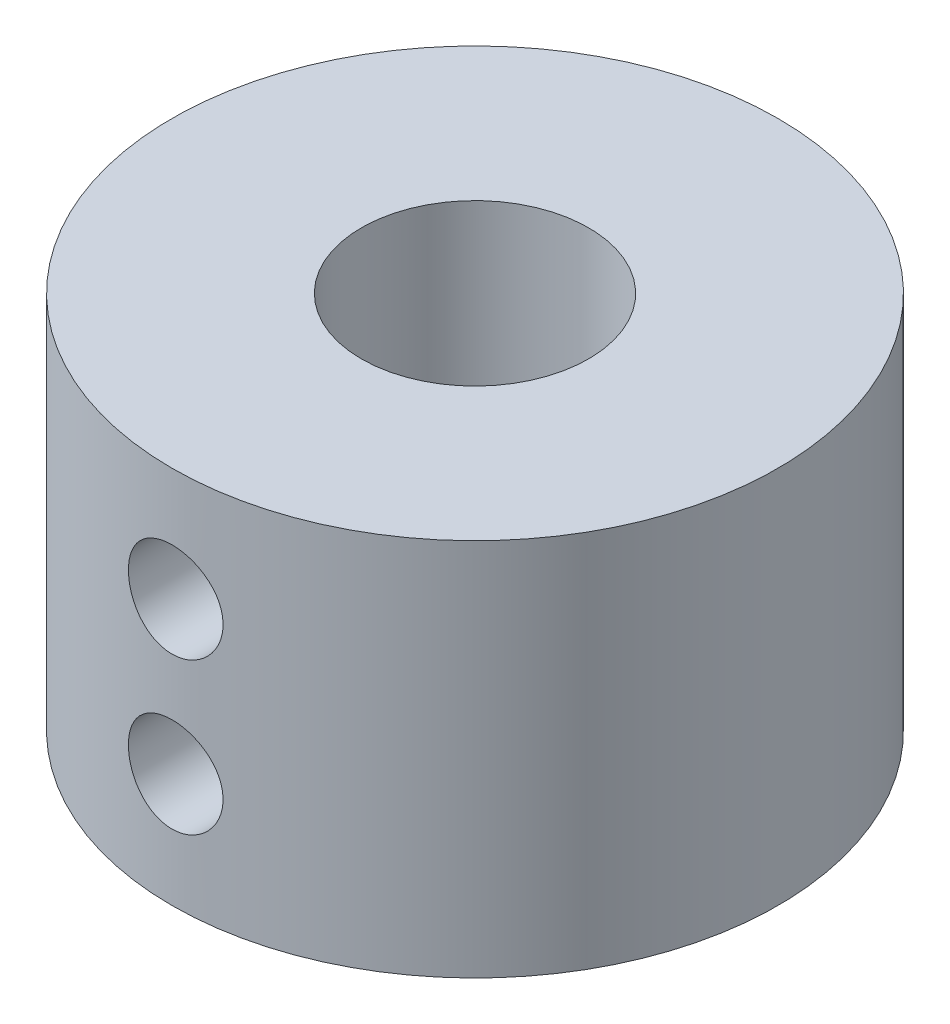
ISO-10303-21;
HEADER;
FILE_DESCRIPTION(('STEP AP214'),'2;1');
FILE_NAME('part.step','',(''),(''),'','','');
FILE_SCHEMA(('AUTOMOTIVE_DESIGN { 1 0 10303 214 1 1 1 1 }'));
ENDSEC;
DATA;
#1=APPLICATION_CONTEXT('core data for automotive mechanical design processes');
#2=APPLICATION_PROTOCOL_DEFINITION('international standard','automotive_design',2000,#1);
#3=PRODUCT_CONTEXT('',#1,'mechanical');
#4=PRODUCT('Part','Part','',(#3));
#5=PRODUCT_RELATED_PRODUCT_CATEGORY('part','',(#4));
#6=PRODUCT_DEFINITION_FORMATION('','',#4);
#7=PRODUCT_DEFINITION_CONTEXT('part definition',#1,'design');
#8=PRODUCT_DEFINITION('design','',#6,#7);
#9=PRODUCT_DEFINITION_SHAPE('','',#8);
#10=(LENGTH_UNIT() NAMED_UNIT(*) SI_UNIT(.MILLI.,.METRE.));
#11=(NAMED_UNIT(*) PLANE_ANGLE_UNIT() SI_UNIT($,.RADIAN.));
#12=(NAMED_UNIT(*) SI_UNIT($,.STERADIAN.) SOLID_ANGLE_UNIT());
#13=UNCERTAINTY_MEASURE_WITH_UNIT(LENGTH_MEASURE(1.E-05),#10,'distance_accuracy_value','');
#14=(GEOMETRIC_REPRESENTATION_CONTEXT(3) GLOBAL_UNCERTAINTY_ASSIGNED_CONTEXT((#13)) GLOBAL_UNIT_ASSIGNED_CONTEXT((#10,
#11,#12)) REPRESENTATION_CONTEXT('',''));
#15=CARTESIAN_POINT('',(0.,0.,0.));
#16=DIRECTION('',(0.,0.,1.));
#17=DIRECTION('',(1.,0.,0.));
#18=AXIS2_PLACEMENT_3D('',#15,#16,#17);
#19=CARTESIAN_POINT('',(0.,15.875,0.));
#20=DIRECTION('',(0.,-1.,0.));
#21=DIRECTION('',(0.,0.,-1.));
#22=AXIS2_PLACEMENT_3D('',#19,#20,#21);
#23=CYLINDRICAL_SURFACE('',#22,12.7);
#24=CARTESIAN_POINT('',(0.,15.875,0.));
#25=DIRECTION('',(0.,1.,0.));
#26=DIRECTION('',(0.,0.,1.));
#27=AXIS2_PLACEMENT_3D('',#24,#25,#26);
#28=CIRCLE('',#27,12.7);
#29=CARTESIAN_POINT('',(0.,15.875,12.7));
#30=VERTEX_POINT('',#29);
#31=EDGE_CURVE('E10',#30,#30,#28,.T.);
#32=ORIENTED_EDGE('',*,*,#31,.F.);
#33=EDGE_LOOP('',(#32));
#34=FACE_BOUND('',#33,.T.);
#35=CARTESIAN_POINT('',(0.,0.,0.));
#36=DIRECTION('',(0.,1.,0.));
#37=DIRECTION('',(0.,0.,1.));
#38=AXIS2_PLACEMENT_3D('',#35,#36,#37);
#39=CIRCLE('',#38,12.7);
#40=CARTESIAN_POINT('',(0.,0.,12.7));
#41=VERTEX_POINT('',#40);
#42=EDGE_CURVE('E43',#41,#41,#39,.T.);
#43=ORIENTED_EDGE('',*,*,#42,.T.);
#44=EDGE_LOOP('',(#43));
#45=FACE_BOUND('',#44,.T.);
#46=CARTESIAN_POINT('',(0.,2.778125,12.7));
#47=CARTESIAN_POINT('',(0.110740108458882,2.77812952300302,12.6999981759187));
#48=CARTESIAN_POINT('',(0.221543090112152,2.78742625280776,12.6985364241056));
#49=CARTESIAN_POINT('',(0.440048106263868,2.82435592995092,12.6928459161496));
#50=CARTESIAN_POINT('',(0.547747079925383,2.85200637092466,12.688614520205));
#51=CARTESIAN_POINT('',(0.756850577075127,2.92479385735275,12.6778599087533));
#52=CARTESIAN_POINT('',(0.858259929630111,2.96991728958077,12.6713384777827));
#53=CARTESIAN_POINT('',(1.05205311801665,3.07633572020615,12.6567231151778));
#54=CARTESIAN_POINT('',(1.14443812447984,3.13762861728478,12.648629387909));
#55=CARTESIAN_POINT('',(1.31835517987347,3.27519748213095,12.6316920055389));
#56=CARTESIAN_POINT('',(1.39979993656947,3.35158317719414,12.6228431454267));
#57=CARTESIAN_POINT('',(1.54877110253116,3.51693317143843,12.6054332292841));
#58=CARTESIAN_POINT('',(1.61629668369265,3.60589821848203,12.5968721904028));
#59=CARTESIAN_POINT('',(1.73585619561051,3.79447287787908,12.5809567732616));
#60=CARTESIAN_POINT('',(1.78780498386656,3.89413708912467,12.5736091220522));
#61=CARTESIAN_POINT('',(1.8741920351767,4.10091049486838,12.56102391383));
#62=CARTESIAN_POINT('',(1.90863133489238,4.20801924818026,12.5557862318988));
#63=CARTESIAN_POINT('',(1.9587492521197,4.42572052778288,12.5480654114313));
#64=CARTESIAN_POINT('',(1.974577787307,4.53627774624367,12.5455602731006));
#65=CARTESIAN_POINT('',(1.98748943495112,4.75850520618354,12.5435214828822));
#66=CARTESIAN_POINT('',(1.98457371420495,4.87017537795117,12.5439876460362));
#67=CARTESIAN_POINT('',(1.96020198517056,5.09039576903307,12.5478186817382));
#68=CARTESIAN_POINT('',(1.93891346849256,5.19896504603656,12.551157366718));
#69=CARTESIAN_POINT('',(1.8786628815554,5.41097153004771,12.5603163222422));
#70=CARTESIAN_POINT('',(1.8397002725553,5.51440858050843,12.5661366684321));
#71=CARTESIAN_POINT('',(1.74503490328574,5.71372104068749,12.5796318356586));
#72=CARTESIAN_POINT('',(1.68926170525467,5.80956244721987,12.58731443263));
#73=CARTESIAN_POINT('',(1.56260846153893,5.99058963145039,12.6036629288164));
#74=CARTESIAN_POINT('',(1.49172734144582,6.07577465062943,12.6123288979439));
#75=CARTESIAN_POINT('',(1.33595339252727,6.23404125826519,12.6297831783506));
#76=CARTESIAN_POINT('',(1.25091666694928,6.30698125687638,12.6385717957325));
#77=CARTESIAN_POINT('',(1.06973445198237,6.43757693435167,12.6551938074484));
#78=CARTESIAN_POINT('',(0.973588906165797,6.49523253557323,12.6630271969298));
#79=CARTESIAN_POINT('',(0.77279176710109,6.59363209577903,12.6768653547771));
#80=CARTESIAN_POINT('',(0.668134447828366,6.63436455583557,12.6828688790516));
#81=CARTESIAN_POINT('',(0.453349943165552,6.69763548666124,12.6923606325054));
#82=CARTESIAN_POINT('',(0.343223159982964,6.72017529316527,12.6958490463463));
#83=CARTESIAN_POINT('',(0.121847242306214,6.74623148818234,12.6998929368353));
#84=CARTESIAN_POINT('',(0.0106215350725314,6.74994243018735,12.7004784073558));
#85=CARTESIAN_POINT('',(-0.210863296214241,6.73875279013957,12.6987322740244));
#86=CARTESIAN_POINT('',(-0.321122452690593,6.7238528348199,12.6964007684034));
#87=CARTESIAN_POINT('',(-0.536950797973403,6.67602615477886,12.6891012068149));
#88=CARTESIAN_POINT('',(-0.642541626756983,6.64319477312499,12.6841470997096));
#89=CARTESIAN_POINT('',(-0.846720166361197,6.56053814382096,12.6721558507382));
#90=CARTESIAN_POINT('',(-0.94530752410003,6.51071204011113,12.6651186039424));
#91=CARTESIAN_POINT('',(-1.13353231053626,6.39502785704328,12.6496680961312));
#92=CARTESIAN_POINT('',(-1.22309344200333,6.32904704780318,12.6412444712659));
#93=CARTESIAN_POINT('',(-1.38994115353071,6.18309653181069,12.6239895511865));
#94=CARTESIAN_POINT('',(-1.4672269554232,6.10312593888115,12.6151582301731));
#95=CARTESIAN_POINT('',(-1.60804289116498,5.93059742470884,12.5979874685722));
#96=CARTESIAN_POINT('',(-1.6714422262615,5.83793215259665,12.589653201952));
#97=CARTESIAN_POINT('',(-1.78177481883021,5.64315286653132,12.5745136241463));
#98=CARTESIAN_POINT('',(-1.82870855030121,5.54103912468023,12.5677082689496));
#99=CARTESIAN_POINT('',(-1.90457750231339,5.33064272268311,12.5564350038593));
#100=CARTESIAN_POINT('',(-1.93358019864905,5.22238488416729,12.5519583411449));
#101=CARTESIAN_POINT('',(-1.97297771869675,5.00245924221671,12.5458265266038));
#102=CARTESIAN_POINT('',(-1.98337394698717,4.89079169682366,12.5441711618015));
#103=CARTESIAN_POINT('',(-1.98522790573288,4.66852101924844,12.5438777732313));
#104=CARTESIAN_POINT('',(-1.97689137060312,4.55791959180903,12.5452069710905));
#105=CARTESIAN_POINT('',(-1.94195877209371,4.33971279539172,12.5506614853508));
#106=CARTESIAN_POINT('',(-1.91536274825276,4.23210741992676,12.5547867956971));
#107=CARTESIAN_POINT('',(-1.84474111851657,4.02301247510409,12.5653568927858));
#108=CARTESIAN_POINT('',(-1.80073110879998,3.92151752663239,12.5717996035677));
#109=CARTESIAN_POINT('',(-1.69655147533719,3.72731854414446,12.5862808983762));
#110=CARTESIAN_POINT('',(-1.63638121114078,3.63461485873356,12.5943195456484));
#111=CARTESIAN_POINT('',(-1.50084637710394,3.45958672434933,12.6111918217323));
#112=CARTESIAN_POINT('',(-1.42532978756472,3.37738069393777,12.6200328717098));
#113=CARTESIAN_POINT('',(-1.26156715744074,3.22673564361803,12.6374528463983));
#114=CARTESIAN_POINT('',(-1.17331817087256,3.1582998186177,12.6460317098872));
#115=CARTESIAN_POINT('',(-0.985969944206959,3.0367674667187,12.6620198757501));
#116=CARTESIAN_POINT('',(-0.886808751638015,2.98376548537206,12.6694218482903));
#117=CARTESIAN_POINT('',(-0.680919931621491,2.89524995927185,12.6821506249711));
#118=CARTESIAN_POINT('',(-0.574200160161773,2.85971855303178,12.6874795473781));
#119=CARTESIAN_POINT('',(-0.389186927929827,2.81508753950935,12.6942647265525));
#120=CARTESIAN_POINT('',(-0.312027550673476,2.80124813556323,12.6964042460323));
#121=CARTESIAN_POINT('',(-0.156589252043899,2.78276533125536,12.6992725177874));
#122=CARTESIAN_POINT('',(-0.0783103464342374,2.77812180153886,12.700001289907));
#123=CARTESIAN_POINT('',(0.,2.778125,12.7));
#124=B_SPLINE_CURVE_WITH_KNOTS('',3,(#46,#47,#48,#49,#50,#51,#52,#53,#54,#55,#56,#57,#58,#59,
#60,#61,#62,#63,#64,#65,#66,#67,#68,#69,#70,#71,#72,#73,#74,#75,#76,#77,#78,#79,#80,#81,#82,#83,
#84,#85,#86,#87,#88,#89,#90,#91,#92,#93,#94,#95,#96,#97,#98,#99,#100,#101,#102,#103,#104,#105,
#106,#107,#108,#109,#110,#111,#112,#113,#114,#115,#116,#117,#118,#119,#120,#121,#122,#123),
.UNSPECIFIED.,.T.,.F.,(4,2,2,2,2,2,2,2,2,2,2,2,2,2,2,2,2,2,2,2,2,2,2,2,2,2,2,2,2,2,2,2,2,2,2,2,
2,2,4),(0.,0.331934137754008,0.664185110006611,0.996177744306316,1.32812725541174,
1.66258532220808,1.99706328143553,2.33333749268321,2.66959179226083,3.00311844713402,
3.33662434075995,3.66712163467923,3.99762900348021,4.32954094563113,4.66147649976829,
4.99701925040403,5.332563705516,5.66833578480185,6.00408320889956,6.33635427867194,
6.66861415931883,6.99912434275525,7.32965117713987,7.66277154791551,7.99591302771124,
8.33206899948113,8.66821529346378,9.00308882001135,9.33793706632004,9.66912580393961,
10.0003138244125,10.3312058977975,10.6621110867663,10.9964697227546,11.330905846067,
11.6673495395862,12.0034485423967,12.2381805047903,12.4729091652785),.UNSPECIFIED.);
#125=CARTESIAN_POINT('',(0.,2.778125,12.7));
#126=VERTEX_POINT('',#125);
#127=EDGE_CURVE('E59',#126,#126,#124,.T.);
#128=ORIENTED_EDGE('',*,*,#127,.F.);
#129=EDGE_LOOP('',(#128));
#130=FACE_BOUND('',#129,.T.);
#131=CARTESIAN_POINT('',(0.,9.128125,12.7));
#132=CARTESIAN_POINT('',(0.110740108458882,9.12812952300302,12.6999981759187));
#133=CARTESIAN_POINT('',(0.221543090112152,9.13742625280776,12.6985364241056));
#134=CARTESIAN_POINT('',(0.440048106263868,9.17435592995093,12.6928459161496));
#135=CARTESIAN_POINT('',(0.547747079925383,9.20200637092466,12.688614520205));
#136=CARTESIAN_POINT('',(0.756850577075127,9.27479385735275,12.6778599087533));
#137=CARTESIAN_POINT('',(0.85825992963011,9.31991728958077,12.6713384777827));
#138=CARTESIAN_POINT('',(1.05205311801665,9.42633572020615,12.6567231151778));
#139=CARTESIAN_POINT('',(1.14443812447984,9.48762861728478,12.648629387909));
#140=CARTESIAN_POINT('',(1.31835517987347,9.62519748213096,12.6316920055389));
#141=CARTESIAN_POINT('',(1.39979993656947,9.70158317719414,12.6228431454267));
#142=CARTESIAN_POINT('',(1.54877110253116,9.86693317143843,12.6054332292841));
#143=CARTESIAN_POINT('',(1.61629668369265,9.95589821848203,12.5968721904028));
#144=CARTESIAN_POINT('',(1.73585619561051,10.1444728778791,12.5809567732616));
#145=CARTESIAN_POINT('',(1.78780498386656,10.2441370891247,12.5736091220522));
#146=CARTESIAN_POINT('',(1.8741920351767,10.4509104948684,12.56102391383));
#147=CARTESIAN_POINT('',(1.90863133489238,10.5580192481803,12.5557862318988));
#148=CARTESIAN_POINT('',(1.9587492521197,10.7757205277829,12.5480654114313));
#149=CARTESIAN_POINT('',(1.974577787307,10.8862777462437,12.5455602731006));
#150=CARTESIAN_POINT('',(1.98748943495112,11.1085052061835,12.5435214828822));
#151=CARTESIAN_POINT('',(1.98457371420495,11.2201753779512,12.5439876460362));
#152=CARTESIAN_POINT('',(1.96020198517056,11.4403957690331,12.5478186817382));
#153=CARTESIAN_POINT('',(1.93891346849256,11.5489650460366,12.551157366718));
#154=CARTESIAN_POINT('',(1.8786628815554,11.7609715300477,12.5603163222422));
#155=CARTESIAN_POINT('',(1.8397002725553,11.8644085805084,12.5661366684321));
#156=CARTESIAN_POINT('',(1.74503490328574,12.0637210406875,12.5796318356586));
#157=CARTESIAN_POINT('',(1.68926170525467,12.1595624472199,12.58731443263));
#158=CARTESIAN_POINT('',(1.56260846153893,12.3405896314504,12.6036629288164));
#159=CARTESIAN_POINT('',(1.49172734144582,12.4257746506294,12.6123288979439));
#160=CARTESIAN_POINT('',(1.33595339252727,12.5840412582652,12.6297831783506));
#161=CARTESIAN_POINT('',(1.25091666694928,12.6569812568764,12.6385717957325));
#162=CARTESIAN_POINT('',(1.06973445198237,12.7875769343517,12.6551938074484));
#163=CARTESIAN_POINT('',(0.973588906165797,12.8452325355732,12.6630271969298));
#164=CARTESIAN_POINT('',(0.772791767101091,12.943632095779,12.6768653547771));
#165=CARTESIAN_POINT('',(0.668134447828366,12.9843645558356,12.6828688790516));
#166=CARTESIAN_POINT('',(0.453349943165554,13.0476354866612,12.6923606325054));
#167=CARTESIAN_POINT('',(0.343223159982966,13.0701752931653,12.6958490463463));
#168=CARTESIAN_POINT('',(0.121847242306215,13.0962314881823,12.6998929368353));
#169=CARTESIAN_POINT('',(0.0106215350725325,13.0999424301873,12.7004784073558));
#170=CARTESIAN_POINT('',(-0.21086329621424,13.0887527901396,12.6987322740244));
#171=CARTESIAN_POINT('',(-0.321122452690592,13.0738528348199,12.6964007684034));
#172=CARTESIAN_POINT('',(-0.536950797973402,13.0260261547789,12.6891012068149));
#173=CARTESIAN_POINT('',(-0.642541626756983,12.993194773125,12.6841470997096));
#174=CARTESIAN_POINT('',(-0.846720166361197,12.910538143821,12.6721558507382));
#175=CARTESIAN_POINT('',(-0.945307524100029,12.8607120401111,12.6651186039424));
#176=CARTESIAN_POINT('',(-1.13353231053626,12.7450278570433,12.6496680961312));
#177=CARTESIAN_POINT('',(-1.22309344200333,12.6790470478032,12.6412444712659));
#178=CARTESIAN_POINT('',(-1.38994115353071,12.5330965318107,12.6239895511865));
#179=CARTESIAN_POINT('',(-1.4672269554232,12.4531259388812,12.6151582301731));
#180=CARTESIAN_POINT('',(-1.60804289116498,12.2805974247088,12.5979874685722));
#181=CARTESIAN_POINT('',(-1.6714422262615,12.1879321525967,12.589653201952));
#182=CARTESIAN_POINT('',(-1.78177481883021,11.9931528665313,12.5745136241463));
#183=CARTESIAN_POINT('',(-1.82870855030121,11.8910391246802,12.5677082689496));
#184=CARTESIAN_POINT('',(-1.90457750231339,11.6806427226831,12.5564350038593));
#185=CARTESIAN_POINT('',(-1.93358019864905,11.5723848841673,12.5519583411449));
#186=CARTESIAN_POINT('',(-1.97297771869675,11.3524592422167,12.5458265266038));
#187=CARTESIAN_POINT('',(-1.98337394698717,11.2407916968237,12.5441711618015));
#188=CARTESIAN_POINT('',(-1.98522790573288,11.0185210192484,12.5438777732313));
#189=CARTESIAN_POINT('',(-1.97689137060312,10.907919591809,12.5452069710905));
#190=CARTESIAN_POINT('',(-1.94195877209371,10.6897127953917,12.5506614853508));
#191=CARTESIAN_POINT('',(-1.91536274825276,10.5821074199268,12.5547867956971));
#192=CARTESIAN_POINT('',(-1.84474111851657,10.3730124751041,12.5653568927858));
#193=CARTESIAN_POINT('',(-1.80073110879999,10.2715175266324,12.5717996035677));
#194=CARTESIAN_POINT('',(-1.69655147533719,10.0773185441445,12.5862808983762));
#195=CARTESIAN_POINT('',(-1.63638121114078,9.98461485873356,12.5943195456484));
#196=CARTESIAN_POINT('',(-1.50084637710394,9.80958672434933,12.6111918217323));
#197=CARTESIAN_POINT('',(-1.42532978756472,9.72738069393777,12.6200328717098));
#198=CARTESIAN_POINT('',(-1.26156715744075,9.57673564361803,12.6374528463983));
#199=CARTESIAN_POINT('',(-1.17331817087256,9.5082998186177,12.6460317098872));
#200=CARTESIAN_POINT('',(-0.98596994420696,9.3867674667187,12.6620198757501));
#201=CARTESIAN_POINT('',(-0.886808751638016,9.33376548537206,12.6694218482903));
#202=CARTESIAN_POINT('',(-0.680919931621491,9.24524995927185,12.6821506249711));
#203=CARTESIAN_POINT('',(-0.574200160161774,9.20971855303178,12.6874795473781));
#204=CARTESIAN_POINT('',(-0.389186927929828,9.16508753950935,12.6942647265525));
#205=CARTESIAN_POINT('',(-0.312027550673478,9.15124813556323,12.6964042460323));
#206=CARTESIAN_POINT('',(-0.1565892520439,9.13276533125536,12.6992725177874));
#207=CARTESIAN_POINT('',(-0.0783103464342379,9.12812180153886,12.700001289907));
#208=CARTESIAN_POINT('',(0.,9.128125,12.7));
#209=B_SPLINE_CURVE_WITH_KNOTS('',3,(#131,#132,#133,#134,#135,#136,#137,#138,#139,#140,#141,
#142,#143,#144,#145,#146,#147,#148,#149,#150,#151,#152,#153,#154,#155,#156,#157,#158,#159,#160,
#161,#162,#163,#164,#165,#166,#167,#168,#169,#170,#171,#172,#173,#174,#175,#176,#177,#178,#179,
#180,#181,#182,#183,#184,#185,#186,#187,#188,#189,#190,#191,#192,#193,#194,#195,#196,#197,#198,
#199,#200,#201,#202,#203,#204,#205,#206,#207,#208),.UNSPECIFIED.,.T.,.F.,(4,2,2,2,2,2,2,2,2,2,2,
2,2,2,2,2,2,2,2,2,2,2,2,2,2,2,2,2,2,2,2,2,2,2,2,2,2,2,4),(0.,0.331934137754008,
0.664185110006611,0.996177744306315,1.32812725541174,1.66258532220808,1.99706328143553,
2.33333749268321,2.66959179226083,3.00311844713402,3.33662434075995,3.66712163467923,
3.99762900348021,4.32954094563113,4.66147649976829,4.99701925040403,5.332563705516,
5.66833578480185,6.00408320889956,6.33635427867194,6.66861415931883,6.99912434275525,
7.32965117713987,7.66277154791551,7.99591302771124,8.33206899948113,8.66821529346379,
9.00308882001135,9.33793706632004,9.66912580393961,10.0003138244125,10.3312058977975,
10.6621110867663,10.9964697227546,11.330905846067,11.6673495395863,12.0034485423967,
12.2381805047903,12.4729091652785),.UNSPECIFIED.);
#210=CARTESIAN_POINT('',(0.,9.128125,12.7));
#211=VERTEX_POINT('',#210);
#212=EDGE_CURVE('E60',#211,#211,#209,.T.);
#213=ORIENTED_EDGE('',*,*,#212,.F.);
#214=EDGE_LOOP('',(#213));
#215=FACE_BOUND('',#214,.T.);
#216=ADVANCED_FACE('F30',(#34,#45,#130,#215),#23,.T.);
#217=CARTESIAN_POINT('',(0.,0.,0.));
#218=DIRECTION('',(0.,1.,0.));
#219=DIRECTION('',(0.,0.,1.));
#220=AXIS2_PLACEMENT_3D('',#217,#218,#219);
#221=CYLINDRICAL_SURFACE('',#220,4.7625);
#222=CARTESIAN_POINT('',(0.,2.778125,4.7625));
#223=CARTESIAN_POINT('',(-0.106295908560074,2.77813643808244,4.76249140158045));
#224=CARTESIAN_POINT('',(-0.212758967838847,2.78671648416341,4.75890007347352));
#225=CARTESIAN_POINT('',(-0.422667701710701,2.82073201556078,4.74488118807538));
#226=CARTESIAN_POINT('',(-0.526104765072409,2.84621148508699,4.73443579242881));
#227=CARTESIAN_POINT('',(-0.726580864674277,2.91292135820168,4.70783108848027));
#228=CARTESIAN_POINT('',(-0.823640282526702,2.95409840578068,4.69169114960318));
#229=CARTESIAN_POINT('',(-1.00937973872919,3.0508143568817,4.65526892272179));
#230=CARTESIAN_POINT('',(-1.0980623041503,3.10634891011625,4.63498788984898));
#231=CARTESIAN_POINT('',(-1.26912434065073,3.23314850986302,4.59117427508592));
#232=CARTESIAN_POINT('',(-1.35102801218446,3.30501832770373,4.56753520905172));
#233=CARTESIAN_POINT('',(-1.50202871598238,3.46116963146733,4.52013183583765));
#234=CARTESIAN_POINT('',(-1.57111900525552,3.54545761077003,4.4963674694456));
#235=CARTESIAN_POINT('',(-1.69789058594092,3.72908000938427,4.4500962212813));
#236=CARTESIAN_POINT('',(-1.75484326694356,3.82895069937714,4.42770874161498));
#237=CARTESIAN_POINT('',(-1.85092880684824,4.03792254694948,4.38841471116745));
#238=CARTESIAN_POINT('',(-1.89007084577612,4.14701891493157,4.37150533813807));
#239=CARTESIAN_POINT('',(-1.94745924820552,4.36586898568157,4.34623456677981));
#240=CARTESIAN_POINT('',(-1.96662131880699,4.47533789238504,4.33750065397212));
#241=CARTESIAN_POINT('',(-1.98636270823877,4.69625885213993,4.32849855373462));
#242=CARTESIAN_POINT('',(-1.98695227536356,4.80770977754086,4.328225697501));
#243=CARTESIAN_POINT('',(-1.97022164952332,5.02031009594046,4.33586127302853));
#244=CARTESIAN_POINT('',(-1.95427093765778,5.12159424079608,4.34314413823751));
#245=CARTESIAN_POINT('',(-1.90720965737546,5.31989044446312,4.36401341403402));
#246=CARTESIAN_POINT('',(-1.87609618568393,5.41690168124319,4.37760103179407));
#247=CARTESIAN_POINT('',(-1.79898609480019,5.60634785349891,4.40985568326751));
#248=CARTESIAN_POINT('',(-1.75268686068537,5.69864148069999,4.42862465094254));
#249=CARTESIAN_POINT('',(-1.64673347596643,5.87450840253473,4.46910350686474));
#250=CARTESIAN_POINT('',(-1.58707405869978,5.95807823909896,4.49081455356025));
#251=CARTESIAN_POINT('',(-1.45017484530084,6.12155868448838,4.53696350793792));
#252=CARTESIAN_POINT('',(-1.37187540459195,6.20056317572438,4.561476802296));
#253=CARTESIAN_POINT('',(-1.20289572579428,6.3446239359477,4.6089200606614));
#254=CARTESIAN_POINT('',(-1.11221259562443,6.40967693756133,4.63184965292253));
#255=CARTESIAN_POINT('',(-0.918286118550738,6.52531686999082,4.67420775145901));
#256=CARTESIAN_POINT('',(-0.814801174635695,6.57553524417671,4.69354323137542));
#257=CARTESIAN_POINT('',(-0.599840689011348,6.65753230912018,4.72582051746));
#258=CARTESIAN_POINT('',(-0.488369601737121,6.68932119071081,4.73876585655208));
#259=CARTESIAN_POINT('',(-0.26817337993714,6.73166038750104,4.75614430383386));
#260=CARTESIAN_POINT('',(-0.159720415379842,6.74342672369195,4.76106396412311));
#261=CARTESIAN_POINT('',(0.0577130156000391,6.74901212998737,4.76338979960382));
#262=CARTESIAN_POINT('',(0.166693321604807,6.74283635277505,4.76079813192703));
#263=CARTESIAN_POINT('',(0.376393459717026,6.71358340287037,4.74870808030392));
#264=CARTESIAN_POINT('',(0.477254834540024,6.6913601978707,4.73955883563333));
#265=CARTESIAN_POINT('',(0.673707613991605,6.63183174116651,4.71564663251208));
#266=CARTESIAN_POINT('',(0.769298351097896,6.5945245840539,4.7008829648603));
#267=CARTESIAN_POINT('',(0.955848037292253,6.50466857605702,4.666587546492));
#268=CARTESIAN_POINT('',(1.04657086350783,6.45168225925568,4.64692192707484));
#269=CARTESIAN_POINT('',(1.21816211826739,6.33245276275569,4.60492164769306));
#270=CARTESIAN_POINT('',(1.29902640975558,6.26620404819728,4.58258587495364));
#271=CARTESIAN_POINT('',(1.45467932056039,6.11679111718006,4.53567939534007));
#272=CARTESIAN_POINT('',(1.52862073304299,6.03275637650931,4.51106304400759));
#273=CARTESIAN_POINT('',(1.66158838069249,5.85307872445257,4.46380134619208));
#274=CARTESIAN_POINT('',(1.72061122865918,5.75743318416488,4.44115644808334));
#275=CARTESIAN_POINT('',(1.8227033683131,5.55527499670716,4.40025450662331));
#276=CARTESIAN_POINT('',(1.8655334520176,5.44862696862021,4.38206455556239));
#277=CARTESIAN_POINT('',(1.93226394648122,5.22863668232646,4.35305764608594));
#278=CARTESIAN_POINT('',(1.95617996596104,5.11530002705769,4.34223460919756));
#279=CARTESIAN_POINT('',(1.9828522755388,4.89455031502126,4.33011523702906));
#280=CARTESIAN_POINT('',(1.98709566405843,4.78735284861048,4.32814969660371));
#281=CARTESIAN_POINT('',(1.97827226144211,4.57383695793851,4.33218991655));
#282=CARTESIAN_POINT('',(1.96520812768995,4.46751840125201,4.33819445320236));
#283=CARTESIAN_POINT('',(1.9233896758903,4.26387776339314,4.3568866269235));
#284=CARTESIAN_POINT('',(1.89539409419703,4.16636728087687,4.36925013318787));
#285=CARTESIAN_POINT('',(1.82524921020889,3.9774050160954,4.39901300153712));
#286=CARTESIAN_POINT('',(1.78309593083638,3.88595494492943,4.41641377846563));
#287=CARTESIAN_POINT('',(1.6829132892259,3.70570776518077,4.45558790364021));
#288=CARTESIAN_POINT('',(1.62408172945392,3.61740080085784,4.47756125557966));
#289=CARTESIAN_POINT('',(1.49333596530075,3.45144702876492,4.5228460637297));
#290=CARTESIAN_POINT('',(1.42141722463767,3.37380393373409,4.54615798199076));
#291=CARTESIAN_POINT('',(1.26031949767388,3.22556396782547,4.59353273649544));
#292=CARTESIAN_POINT('',(1.17026489966908,3.15589216286547,4.61752660299969));
#293=CARTESIAN_POINT('',(0.978852625814456,3.0326021174995,4.66185477999957));
#294=CARTESIAN_POINT('',(0.877489827988874,2.97899119261283,4.68218742117825));
#295=CARTESIAN_POINT('',(0.667912140039749,2.89050437036418,4.71660828587906));
#296=CARTESIAN_POINT('',(0.559838210681762,2.85533343299504,4.73079417348867));
#297=CARTESIAN_POINT('',(0.338789044681414,2.80399120258894,4.75172103007692));
#298=CARTESIAN_POINT('',(0.225830315707272,2.78776042248381,4.75848530476497));
#299=CARTESIAN_POINT('',(0.0749872800467045,2.77918360677526,4.76206006515682));
#300=CARTESIAN_POINT('',(0.0375040440476062,2.77812096433811,4.76250303375275));
#301=CARTESIAN_POINT('',(0.,2.778125,4.7625));
#302=B_SPLINE_CURVE_WITH_KNOTS('',3,(#222,#223,#224,#225,#226,#227,#228,#229,#230,#231,#232,
#233,#234,#235,#236,#237,#238,#239,#240,#241,#242,#243,#244,#245,#246,#247,#248,#249,#250,#251,
#252,#253,#254,#255,#256,#257,#258,#259,#260,#261,#262,#263,#264,#265,#266,#267,#268,#269,#270,
#271,#272,#273,#274,#275,#276,#277,#278,#279,#280,#281,#282,#283,#284,#285,#286,#287,#288,#289,
#290,#291,#292,#293,#294,#295,#296,#297,#298,#299,#300,#301),.UNSPECIFIED.,.T.,.F.,(4,2,2,2,2,2,
2,2,2,2,2,2,2,2,2,2,2,2,2,2,2,2,2,2,2,2,2,2,2,2,2,2,2,2,2,2,2,2,2,4),(0.,0.318780983728253,
0.638394933248056,0.956932064901253,1.2753727935041,1.60842223858481,1.94164645533701,
2.29126612705861,2.64070539184808,2.97331246105873,3.30573599470361,3.61267624559058,
3.9196752906695,4.23320706980709,4.54686266326065,4.88702574040536,5.22726839536908,
5.57536437409041,5.92326768446547,6.24916903886786,6.5749768089541,6.88461586205458,
7.19429404105334,7.51359202244556,7.83302353682825,8.17528349746505,8.51762109719042,
8.86483476520744,9.21176159730897,9.53198305625935,9.8521553543484,10.1574226931906,
10.462775857341,10.7864893076844,11.1103151781369,11.4577262432026,11.8052953096788,
12.1471190861328,12.4878663512005,12.6003408219232),.UNSPECIFIED.);
#303=CARTESIAN_POINT('',(0.,2.778125,4.7625));
#304=VERTEX_POINT('',#303);
#305=EDGE_CURVE('E53',#304,#304,#302,.T.);
#306=ORIENTED_EDGE('',*,*,#305,.F.);
#307=EDGE_LOOP('',(#306));
#308=FACE_BOUND('',#307,.T.);
#309=CARTESIAN_POINT('',(0.,0.,0.));
#310=DIRECTION('',(0.,1.,0.));
#311=DIRECTION('',(0.,0.,1.));
#312=AXIS2_PLACEMENT_3D('',#309,#310,#311);
#313=CIRCLE('',#312,4.7625);
#314=CARTESIAN_POINT('',(0.,0.,4.7625));
#315=VERTEX_POINT('',#314);
#316=EDGE_CURVE('E48',#315,#315,#313,.T.);
#317=ORIENTED_EDGE('',*,*,#316,.F.);
#318=EDGE_LOOP('',(#317));
#319=FACE_BOUND('',#318,.T.);
#320=CARTESIAN_POINT('',(0.,15.875,0.));
#321=DIRECTION('',(0.,1.,0.));
#322=DIRECTION('',(0.,0.,1.));
#323=AXIS2_PLACEMENT_3D('',#320,#321,#322);
#324=CIRCLE('',#323,4.7625);
#325=CARTESIAN_POINT('',(0.,15.875,4.7625));
#326=VERTEX_POINT('',#325);
#327=EDGE_CURVE('E51',#326,#326,#324,.T.);
#328=ORIENTED_EDGE('',*,*,#327,.T.);
#329=EDGE_LOOP('',(#328));
#330=FACE_BOUND('',#329,.T.);
#331=CARTESIAN_POINT('',(0.,9.128125,4.7625));
#332=CARTESIAN_POINT('',(-0.106295908560074,9.12813643808244,4.76249140158045));
#333=CARTESIAN_POINT('',(-0.212758967838847,9.13671648416341,4.75890007347352));
#334=CARTESIAN_POINT('',(-0.422667701710701,9.17073201556078,4.74488118807538));
#335=CARTESIAN_POINT('',(-0.526104765072409,9.19621148508699,4.73443579242881));
#336=CARTESIAN_POINT('',(-0.726580864674277,9.26292135820169,4.70783108848027));
#337=CARTESIAN_POINT('',(-0.823640282526702,9.30409840578069,4.69169114960318));
#338=CARTESIAN_POINT('',(-1.00937973872919,9.4008143568817,4.65526892272179));
#339=CARTESIAN_POINT('',(-1.0980623041503,9.45634891011625,4.63498788984898));
#340=CARTESIAN_POINT('',(-1.26912434065073,9.58314850986302,4.59117427508592));
#341=CARTESIAN_POINT('',(-1.35102801218446,9.65501832770373,4.56753520905172));
#342=CARTESIAN_POINT('',(-1.50202871598238,9.81116963146733,4.52013183583765));
#343=CARTESIAN_POINT('',(-1.57111900525552,9.89545761077003,4.4963674694456));
#344=CARTESIAN_POINT('',(-1.69789058594092,10.0790800093843,4.4500962212813));
#345=CARTESIAN_POINT('',(-1.75484326694356,10.1789506993771,4.42770874161498));
#346=CARTESIAN_POINT('',(-1.85092880684824,10.3879225469495,4.38841471116745));
#347=CARTESIAN_POINT('',(-1.89007084577612,10.4970189149316,4.37150533813807));
#348=CARTESIAN_POINT('',(-1.94745924820552,10.7158689856816,4.34623456677981));
#349=CARTESIAN_POINT('',(-1.96662131880699,10.825337892385,4.33750065397212));
#350=CARTESIAN_POINT('',(-1.98636270823877,11.0462588521399,4.32849855373462));
#351=CARTESIAN_POINT('',(-1.98695227536356,11.1577097775409,4.328225697501));
#352=CARTESIAN_POINT('',(-1.97022164952332,11.3703100959405,4.33586127302853));
#353=CARTESIAN_POINT('',(-1.95427093765778,11.4715942407961,4.34314413823751));
#354=CARTESIAN_POINT('',(-1.90720965737545,11.6698904444631,4.36401341403401));
#355=CARTESIAN_POINT('',(-1.87609618568393,11.7669016812432,4.37760103179407));
#356=CARTESIAN_POINT('',(-1.79898609480019,11.9563478534989,4.40985568326751));
#357=CARTESIAN_POINT('',(-1.75268686068537,12.0486414807,4.42862465094254));
#358=CARTESIAN_POINT('',(-1.64673347596643,12.2245084025347,4.46910350686474));
#359=CARTESIAN_POINT('',(-1.58707405869978,12.308078239099,4.49081455356025));
#360=CARTESIAN_POINT('',(-1.45017484530084,12.4715586844884,4.53696350793792));
#361=CARTESIAN_POINT('',(-1.37187540459195,12.5505631757244,4.561476802296));
#362=CARTESIAN_POINT('',(-1.20289572579428,12.6946239359477,4.6089200606614));
#363=CARTESIAN_POINT('',(-1.11221259562443,12.7596769375613,4.63184965292253));
#364=CARTESIAN_POINT('',(-0.918286118550737,12.8753168699908,4.67420775145901));
#365=CARTESIAN_POINT('',(-0.814801174635694,12.9255352441767,4.69354323137542));
#366=CARTESIAN_POINT('',(-0.599840689011347,13.0075323091202,4.72582051746));
#367=CARTESIAN_POINT('',(-0.488369601737119,13.0393211907108,4.73876585655208));
#368=CARTESIAN_POINT('',(-0.268173379937138,13.081660387501,4.75614430383386));
#369=CARTESIAN_POINT('',(-0.159720415379841,13.093426723692,4.76106396412311));
#370=CARTESIAN_POINT('',(0.0577130156000402,13.0990121299874,4.76338979960382));
#371=CARTESIAN_POINT('',(0.166693321604808,13.0928363527751,4.76079813192703));
#372=CARTESIAN_POINT('',(0.376393459717027,13.0635834028704,4.74870808030392));
#373=CARTESIAN_POINT('',(0.477254834540025,13.0413601978707,4.73955883563333));
#374=CARTESIAN_POINT('',(0.673707613991606,12.9818317411665,4.71564663251208));
#375=CARTESIAN_POINT('',(0.769298351097898,12.9445245840539,4.7008829648603));
#376=CARTESIAN_POINT('',(0.955848037292254,12.854668576057,4.666587546492));
#377=CARTESIAN_POINT('',(1.04657086350783,12.8016822592557,4.64692192707484));
#378=CARTESIAN_POINT('',(1.21816211826739,12.6824527627557,4.60492164769306));
#379=CARTESIAN_POINT('',(1.29902640975558,12.6162040481973,4.58258587495363));
#380=CARTESIAN_POINT('',(1.45467932056039,12.4667911171801,4.53567939534007));
#381=CARTESIAN_POINT('',(1.52862073304299,12.3827563765093,4.51106304400759));
#382=CARTESIAN_POINT('',(1.66158838069249,12.2030787244526,4.46380134619208));
#383=CARTESIAN_POINT('',(1.72061122865918,12.1074331841649,4.44115644808334));
#384=CARTESIAN_POINT('',(1.8227033683131,11.9052749967072,4.40025450662331));
#385=CARTESIAN_POINT('',(1.8655334520176,11.7986269686202,4.38206455556239));
#386=CARTESIAN_POINT('',(1.93226394648122,11.5786366823265,4.35305764608594));
#387=CARTESIAN_POINT('',(1.95617996596104,11.4653000270577,4.34223460919756));
#388=CARTESIAN_POINT('',(1.9828522755388,11.2445503150213,4.33011523702906));
#389=CARTESIAN_POINT('',(1.98709566405843,11.1373528486105,4.32814969660371));
#390=CARTESIAN_POINT('',(1.97827226144211,10.9238369579385,4.33218991655));
#391=CARTESIAN_POINT('',(1.96520812768995,10.817518401252,4.33819445320236));
#392=CARTESIAN_POINT('',(1.9233896758903,10.6138777633931,4.3568866269235));
#393=CARTESIAN_POINT('',(1.89539409419703,10.5163672808769,4.36925013318788));
#394=CARTESIAN_POINT('',(1.82524921020889,10.3274050160954,4.39901300153712));
#395=CARTESIAN_POINT('',(1.78309593083638,10.2359549449294,4.41641377846563));
#396=CARTESIAN_POINT('',(1.6829132892259,10.0557077651808,4.45558790364021));
#397=CARTESIAN_POINT('',(1.62408172945392,9.96740080085784,4.47756125557966));
#398=CARTESIAN_POINT('',(1.49333596530075,9.80144702876492,4.5228460637297));
#399=CARTESIAN_POINT('',(1.42141722463767,9.72380393373409,4.54615798199076));
#400=CARTESIAN_POINT('',(1.26031949767388,9.57556396782547,4.59353273649544));
#401=CARTESIAN_POINT('',(1.17026489966908,9.50589216286547,4.61752660299969));
#402=CARTESIAN_POINT('',(0.978852625814455,9.38260211749949,4.66185477999957));
#403=CARTESIAN_POINT('',(0.877489827988872,9.32899119261283,4.68218742117825));
#404=CARTESIAN_POINT('',(0.667912140039746,9.24050437036418,4.71660828587906));
#405=CARTESIAN_POINT('',(0.55983821068176,9.20533343299504,4.73079417348867));
#406=CARTESIAN_POINT('',(0.338789044681413,9.15399120258894,4.75172103007692));
#407=CARTESIAN_POINT('',(0.225830315707271,9.13776042248381,4.75848530476497));
#408=CARTESIAN_POINT('',(0.0749872800467044,9.12918360677526,4.76206006515682));
#409=CARTESIAN_POINT('',(0.0375040440476061,9.12812096433811,4.76250303375275));
#410=CARTESIAN_POINT('',(0.,9.128125,4.7625));
#411=B_SPLINE_CURVE_WITH_KNOTS('',3,(#331,#332,#333,#334,#335,#336,#337,#338,#339,#340,#341,
#342,#343,#344,#345,#346,#347,#348,#349,#350,#351,#352,#353,#354,#355,#356,#357,#358,#359,#360,
#361,#362,#363,#364,#365,#366,#367,#368,#369,#370,#371,#372,#373,#374,#375,#376,#377,#378,#379,
#380,#381,#382,#383,#384,#385,#386,#387,#388,#389,#390,#391,#392,#393,#394,#395,#396,#397,#398,
#399,#400,#401,#402,#403,#404,#405,#406,#407,#408,#409,#410),.UNSPECIFIED.,.T.,.F.,(4,2,2,2,2,2,
2,2,2,2,2,2,2,2,2,2,2,2,2,2,2,2,2,2,2,2,2,2,2,2,2,2,2,2,2,2,2,2,2,4),(0.,0.318780983728253,
0.638394933248056,0.956932064901253,1.2753727935041,1.60842223858481,1.94164645533701,
2.29126612705861,2.64070539184808,2.97331246105873,3.30573599470361,3.61267624559058,
3.9196752906695,4.2332070698071,4.54686266326066,4.88702574040536,5.22726839536909,
5.57536437409041,5.92326768446547,6.24916903886786,6.57497680895411,6.88461586205458,
7.19429404105334,7.51359202244556,7.83302353682825,8.17528349746505,8.51762109719042,
8.86483476520744,9.21176159730897,9.53198305625935,9.8521553543484,10.1574226931906,
10.462775857341,10.7864893076844,11.1103151781369,11.4577262432026,11.8052953096788,
12.1471190861327,12.4878663512005,12.6003408219232),.UNSPECIFIED.);
#412=CARTESIAN_POINT('',(0.,9.128125,4.7625));
#413=VERTEX_POINT('',#412);
#414=EDGE_CURVE('E34',#413,#413,#411,.T.);
#415=ORIENTED_EDGE('',*,*,#414,.F.);
#416=EDGE_LOOP('',(#415));
#417=FACE_BOUND('',#416,.T.);
#418=ADVANCED_FACE('F61',(#308,#319,#330,#417),#221,.F.);
#419=CARTESIAN_POINT('',(0.,15.875,0.));
#420=DIRECTION('',(0.,1.,0.));
#421=DIRECTION('',(0.,0.,1.));
#422=AXIS2_PLACEMENT_3D('',#419,#420,#421);
#423=PLANE('',#422);
#424=ORIENTED_EDGE('',*,*,#327,.F.);
#425=EDGE_LOOP('',(#424));
#426=FACE_BOUND('',#425,.T.);
#427=ORIENTED_EDGE('',*,*,#31,.T.);
#428=EDGE_LOOP('',(#427));
#429=FACE_BOUND('',#428,.T.);
#430=ADVANCED_FACE('F89',(#426,#429),#423,.T.);
#431=CARTESIAN_POINT('',(0.,0.,0.));
#432=DIRECTION('',(0.,1.,0.));
#433=DIRECTION('',(0.,0.,1.));
#434=AXIS2_PLACEMENT_3D('',#431,#432,#433);
#435=PLANE('',#434);
#436=ORIENTED_EDGE('',*,*,#316,.T.);
#437=EDGE_LOOP('',(#436));
#438=FACE_BOUND('',#437,.T.);
#439=ORIENTED_EDGE('',*,*,#42,.F.);
#440=EDGE_LOOP('',(#439));
#441=FACE_BOUND('',#440,.T.);
#442=ADVANCED_FACE('F68',(#438,#441),#435,.F.);
#443=CARTESIAN_POINT('',(0.,4.7625,12.7));
#444=DIRECTION('',(0.,0.,-1.));
#445=DIRECTION('',(-1.,0.,0.));
#446=AXIS2_PLACEMENT_3D('',#443,#444,#445);
#447=CYLINDRICAL_SURFACE('',#446,1.984375);
#448=ORIENTED_EDGE('',*,*,#305,.T.);
#449=EDGE_LOOP('',(#448));
#450=FACE_BOUND('',#449,.T.);
#451=ORIENTED_EDGE('',*,*,#127,.T.);
#452=EDGE_LOOP('',(#451));
#453=FACE_BOUND('',#452,.T.);
#454=ADVANCED_FACE('F64',(#450,#453),#447,.F.);
#455=CARTESIAN_POINT('',(0.,11.1125,12.7));
#456=DIRECTION('',(0.,0.,-1.));
#457=DIRECTION('',(-1.,0.,0.));
#458=AXIS2_PLACEMENT_3D('',#455,#456,#457);
#459=CYLINDRICAL_SURFACE('',#458,1.984375);
#460=ORIENTED_EDGE('',*,*,#414,.T.);
#461=EDGE_LOOP('',(#460));
#462=FACE_BOUND('',#461,.T.);
#463=ORIENTED_EDGE('',*,*,#212,.T.);
#464=EDGE_LOOP('',(#463));
#465=FACE_BOUND('',#464,.T.);
#466=ADVANCED_FACE('F67',(#462,#465),#459,.F.);
#467=CLOSED_SHELL('',(#216,#418,#430,#442,#454,#466));
#468=MANIFOLD_SOLID_BREP('B2',#467);
#469=ADVANCED_BREP_SHAPE_REPRESENTATION('',(#18,#468),#14);
#470=SHAPE_DEFINITION_REPRESENTATION(#9,#469);
ENDSEC;
END-ISO-10303-21;
